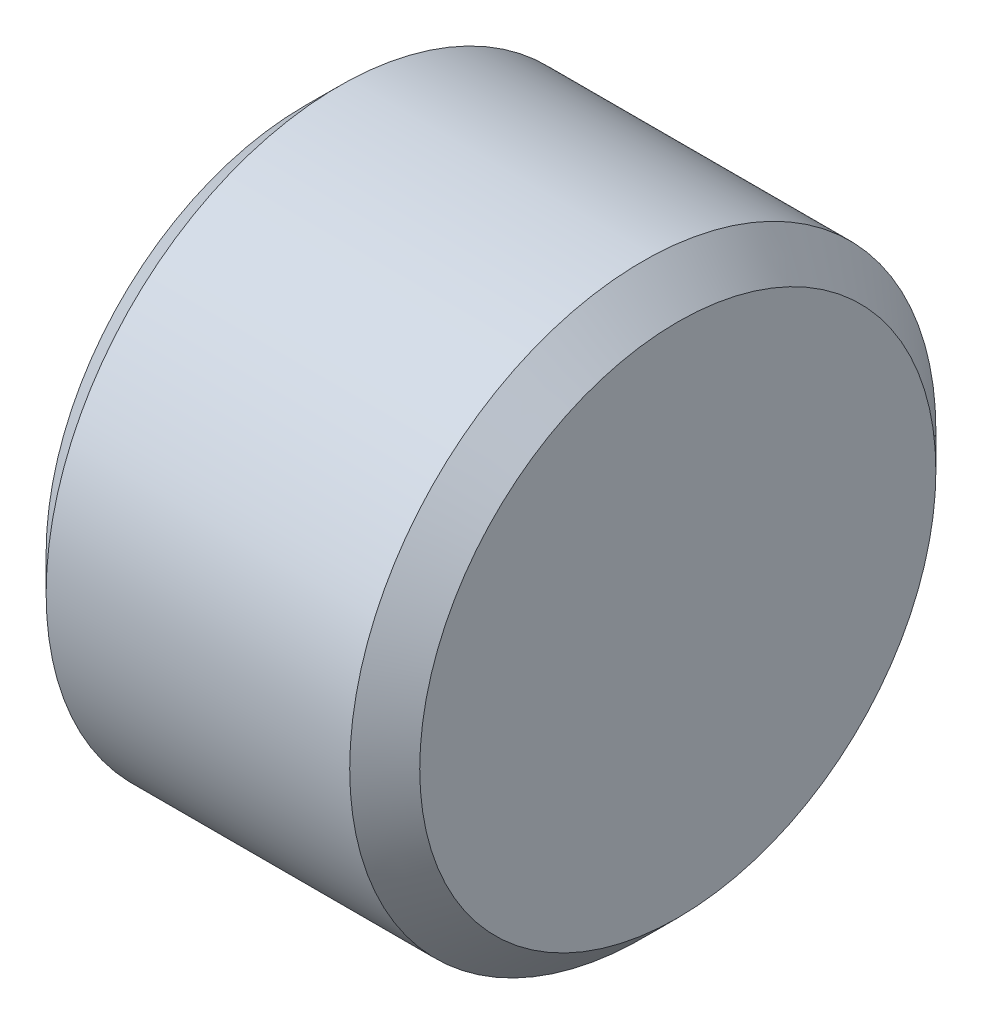
ISO-10303-21;
HEADER;
FILE_DESCRIPTION(('STEP AP214'),'2;1');
FILE_NAME('part.step','',(''),(''),'','','');
FILE_SCHEMA(('AUTOMOTIVE_DESIGN { 1 0 10303 214 1 1 1 1 }'));
ENDSEC;
DATA;
#1=APPLICATION_CONTEXT('core data for automotive mechanical design processes');
#2=APPLICATION_PROTOCOL_DEFINITION('international standard','automotive_design',2000,#1);
#3=PRODUCT_CONTEXT('',#1,'mechanical');
#4=PRODUCT('Part','Part','',(#3));
#5=PRODUCT_RELATED_PRODUCT_CATEGORY('part','',(#4));
#6=PRODUCT_DEFINITION_FORMATION('','',#4);
#7=PRODUCT_DEFINITION_CONTEXT('part definition',#1,'design');
#8=PRODUCT_DEFINITION('design','',#6,#7);
#9=PRODUCT_DEFINITION_SHAPE('','',#8);
#10=(LENGTH_UNIT() NAMED_UNIT(*) SI_UNIT(.MILLI.,.METRE.));
#11=(NAMED_UNIT(*) PLANE_ANGLE_UNIT() SI_UNIT($,.RADIAN.));
#12=(NAMED_UNIT(*) SI_UNIT($,.STERADIAN.) SOLID_ANGLE_UNIT());
#13=UNCERTAINTY_MEASURE_WITH_UNIT(LENGTH_MEASURE(1.E-05),#10,'distance_accuracy_value','');
#14=(GEOMETRIC_REPRESENTATION_CONTEXT(3) GLOBAL_UNCERTAINTY_ASSIGNED_CONTEXT((#13)) GLOBAL_UNIT_ASSIGNED_CONTEXT((#10,
#11,#12)) REPRESENTATION_CONTEXT('',''));
#15=CARTESIAN_POINT('',(0.,0.,0.));
#16=DIRECTION('',(0.,0.,1.));
#17=DIRECTION('',(1.,0.,0.));
#18=AXIS2_PLACEMENT_3D('',#15,#16,#17);
#19=CARTESIAN_POINT('',(0.,-4.283,4.283));
#20=DIRECTION('',(-1.,0.,0.));
#21=DIRECTION('',(0.,1.,0.));
#22=AXIS2_PLACEMENT_3D('',#19,#20,#21);
#23=PLANE('',#22);
#24=CARTESIAN_POINT('',(0.,0.,0.));
#25=DIRECTION('',(-1.,0.,0.));
#26=DIRECTION('',(0.,0.,-1.));
#27=AXIS2_PLACEMENT_3D('',#24,#25,#26);
#28=CIRCLE('',#27,4.283);
#29=CARTESIAN_POINT('',(0.,0.,-4.283));
#30=VERTEX_POINT('',#29);
#31=EDGE_CURVE('E93',#30,#30,#28,.F.);
#32=ORIENTED_EDGE('',*,*,#31,.F.);
#33=EDGE_LOOP('',(#32));
#34=FACE_BOUND('',#33,.T.);
#35=DIRECTION('',(0.,-1.,0.));
#36=VECTOR('',#35,1.);
#37=CARTESIAN_POINT('',(0.,1.2990381056767,2.25));
#38=LINE('',#37,#36);
#39=CARTESIAN_POINT('',(0.,1.2990381056767,2.25));
#40=VERTEX_POINT('',#39);
#41=CARTESIAN_POINT('',(0.,-1.2990381056767,2.25));
#42=VERTEX_POINT('',#41);
#43=EDGE_CURVE('E80',#40,#42,#38,.T.);
#44=ORIENTED_EDGE('',*,*,#43,.T.);
#45=DIRECTION('',(0.,-0.499999999999983,-0.866025403784448));
#46=VECTOR('',#45,1.);
#47=CARTESIAN_POINT('',(0.,-1.2990381056767,2.25));
#48=LINE('',#47,#46);
#49=CARTESIAN_POINT('',(0.,-2.5980762113533,0.));
#50=VERTEX_POINT('',#49);
#51=EDGE_CURVE('E69',#42,#50,#48,.T.);
#52=ORIENTED_EDGE('',*,*,#51,.T.);
#53=DIRECTION('',(0.,0.499999999999984,-0.866025403784448));
#54=VECTOR('',#53,1.);
#55=CARTESIAN_POINT('',(0.,-2.5980762113533,0.));
#56=LINE('',#55,#54);
#57=CARTESIAN_POINT('',(0.,-1.2990381056767,-2.25));
#58=VERTEX_POINT('',#57);
#59=EDGE_CURVE('E79',#50,#58,#56,.T.);
#60=ORIENTED_EDGE('',*,*,#59,.T.);
#61=DIRECTION('',(0.,1.,0.));
#62=VECTOR('',#61,1.);
#63=CARTESIAN_POINT('',(0.,-1.2990381056767,-2.25));
#64=LINE('',#63,#62);
#65=CARTESIAN_POINT('',(0.,1.2990381056767,-2.25));
#66=VERTEX_POINT('',#65);
#67=EDGE_CURVE('E103',#58,#66,#64,.T.);
#68=ORIENTED_EDGE('',*,*,#67,.T.);
#69=DIRECTION('',(0.,0.499999999999983,0.866025403784448));
#70=VECTOR('',#69,1.);
#71=CARTESIAN_POINT('',(0.,1.2990381056767,-2.25));
#72=LINE('',#71,#70);
#73=CARTESIAN_POINT('',(0.,2.5980762113533,0.));
#74=VERTEX_POINT('',#73);
#75=EDGE_CURVE('E108',#66,#74,#72,.T.);
#76=ORIENTED_EDGE('',*,*,#75,.T.);
#77=DIRECTION('',(0.,-0.499999999999983,0.866025403784448));
#78=VECTOR('',#77,1.);
#79=CARTESIAN_POINT('',(0.,2.5980762113533,0.));
#80=LINE('',#79,#78);
#81=EDGE_CURVE('E92',#74,#40,#80,.T.);
#82=ORIENTED_EDGE('',*,*,#81,.T.);
#83=EDGE_LOOP('',(#44,#52,#60,#68,#76,#82));
#84=FACE_BOUND('',#83,.T.);
#85=ADVANCED_FACE('F17',(#34,#84),#23,.T.);
#86=CARTESIAN_POINT('',(6.2,-4.28299979266307,-4.28300000000001));
#87=DIRECTION('',(1.,0.,0.));
#88=DIRECTION('',(0.,1.,0.));
#89=AXIS2_PLACEMENT_3D('',#86,#87,#88);
#90=PLANE('',#89);
#91=CARTESIAN_POINT('',(6.2,0.,0.));
#92=DIRECTION('',(1.,0.,0.));
#93=DIRECTION('',(0.,-1.41924977490617E-07,0.99999999999999));
#94=AXIS2_PLACEMENT_3D('',#91,#92,#93);
#95=CIRCLE('',#94,4.283);
#96=CARTESIAN_POINT('',(6.2,-6.07864678592311E-07,4.28299999999996));
#97=VERTEX_POINT('',#96);
#98=EDGE_CURVE('E115',#97,#97,#95,.T.);
#99=ORIENTED_EDGE('',*,*,#98,.T.);
#100=EDGE_LOOP('',(#99));
#101=FACE_BOUND('',#100,.T.);
#102=ADVANCED_FACE('F177',(#101),#90,.T.);
#103=CARTESIAN_POINT('',(2.,-1.2990381056767,2.25));
#104=DIRECTION('',(0.,0.,-1.));
#105=DIRECTION('',(-1.,0.,0.));
#106=AXIS2_PLACEMENT_3D('',#103,#104,#105);
#107=PLANE('',#106);
#108=ORIENTED_EDGE('',*,*,#43,.F.);
#109=DIRECTION('',(1.,0.,0.));
#110=VECTOR('',#109,1.);
#111=CARTESIAN_POINT('',(0.,1.2990381056767,2.25));
#112=LINE('',#111,#110);
#113=CARTESIAN_POINT('',(2.,1.2990381056767,2.25));
#114=VERTEX_POINT('',#113);
#115=EDGE_CURVE('E120',#114,#40,#112,.F.);
#116=ORIENTED_EDGE('',*,*,#115,.F.);
#117=DIRECTION('',(0.,-1.,0.));
#118=VECTOR('',#117,1.);
#119=CARTESIAN_POINT('',(2.,1.2990381056767,2.25));
#120=LINE('',#119,#118);
#121=CARTESIAN_POINT('',(2.,-1.2990381056767,2.25));
#122=VERTEX_POINT('',#121);
#123=EDGE_CURVE('E87',#114,#122,#120,.T.);
#124=ORIENTED_EDGE('',*,*,#123,.T.);
#125=DIRECTION('',(-1.,0.,0.));
#126=VECTOR('',#125,1.);
#127=CARTESIAN_POINT('',(2.,-1.2990381056767,2.25));
#128=LINE('',#127,#126);
#129=EDGE_CURVE('E73',#122,#42,#128,.T.);
#130=ORIENTED_EDGE('',*,*,#129,.T.);
#131=EDGE_LOOP('',(#108,#116,#124,#130));
#132=FACE_BOUND('',#131,.T.);
#133=ADVANCED_FACE('F85',(#132),#107,.T.);
#134=CARTESIAN_POINT('',(0.,-2.5980762113533,0.));
#135=DIRECTION('',(0.,0.866025403784448,-0.499999999999983));
#136=DIRECTION('',(0.,0.499999999999983,0.866025403784448));
#137=AXIS2_PLACEMENT_3D('',#134,#135,#136);
#138=PLANE('',#137);
#139=ORIENTED_EDGE('',*,*,#51,.F.);
#140=ORIENTED_EDGE('',*,*,#129,.F.);
#141=DIRECTION('',(0.,-0.499999999999983,-0.866025403784448));
#142=VECTOR('',#141,1.);
#143=CARTESIAN_POINT('',(2.,-1.2990381056767,2.25));
#144=LINE('',#143,#142);
#145=CARTESIAN_POINT('',(2.,-2.5980762113533,0.));
#146=VERTEX_POINT('',#145);
#147=EDGE_CURVE('E88',#122,#146,#144,.T.);
#148=ORIENTED_EDGE('',*,*,#147,.T.);
#149=DIRECTION('',(-1.,0.,0.));
#150=VECTOR('',#149,1.);
#151=CARTESIAN_POINT('',(2.,-2.5980762113533,0.));
#152=LINE('',#151,#150);
#153=EDGE_CURVE('E75',#146,#50,#152,.T.);
#154=ORIENTED_EDGE('',*,*,#153,.T.);
#155=EDGE_LOOP('',(#139,#140,#148,#154));
#156=FACE_BOUND('',#155,.T.);
#157=ADVANCED_FACE('F71',(#156),#138,.T.);
#158=CARTESIAN_POINT('',(0.,-1.2990381056767,-2.25));
#159=DIRECTION('',(0.,0.866025403784448,0.499999999999983));
#160=DIRECTION('',(0.,-0.499999999999983,0.866025403784448));
#161=AXIS2_PLACEMENT_3D('',#158,#159,#160);
#162=PLANE('',#161);
#163=ORIENTED_EDGE('',*,*,#59,.F.);
#164=ORIENTED_EDGE('',*,*,#153,.F.);
#165=DIRECTION('',(0.,0.499999999999983,-0.866025403784448));
#166=VECTOR('',#165,1.);
#167=CARTESIAN_POINT('',(2.,-2.5980762113533,0.));
#168=LINE('',#167,#166);
#169=CARTESIAN_POINT('',(2.,-1.2990381056767,-2.25));
#170=VERTEX_POINT('',#169);
#171=EDGE_CURVE('E133',#146,#170,#168,.T.);
#172=ORIENTED_EDGE('',*,*,#171,.T.);
#173=DIRECTION('',(-1.,0.,0.));
#174=VECTOR('',#173,1.);
#175=CARTESIAN_POINT('',(2.,-1.2990381056767,-2.25));
#176=LINE('',#175,#174);
#177=EDGE_CURVE('E138',#170,#58,#176,.T.);
#178=ORIENTED_EDGE('',*,*,#177,.T.);
#179=EDGE_LOOP('',(#163,#164,#172,#178));
#180=FACE_BOUND('',#179,.T.);
#181=ADVANCED_FACE('F190',(#180),#162,.T.);
#182=CARTESIAN_POINT('',(0.,-1.2990381056767,-2.25));
#183=DIRECTION('',(0.,0.,1.));
#184=DIRECTION('',(1.,0.,0.));
#185=AXIS2_PLACEMENT_3D('',#182,#183,#184);
#186=PLANE('',#185);
#187=ORIENTED_EDGE('',*,*,#67,.F.);
#188=ORIENTED_EDGE('',*,*,#177,.F.);
#189=DIRECTION('',(0.,1.,0.));
#190=VECTOR('',#189,1.);
#191=CARTESIAN_POINT('',(2.,-1.2990381056767,-2.25));
#192=LINE('',#191,#190);
#193=CARTESIAN_POINT('',(2.,1.2990381056767,-2.25));
#194=VERTEX_POINT('',#193);
#195=EDGE_CURVE('E143',#170,#194,#192,.T.);
#196=ORIENTED_EDGE('',*,*,#195,.T.);
#197=DIRECTION('',(-1.,0.,0.));
#198=VECTOR('',#197,1.);
#199=CARTESIAN_POINT('',(2.,1.2990381056767,-2.25));
#200=LINE('',#199,#198);
#201=EDGE_CURVE('E147',#194,#66,#200,.T.);
#202=ORIENTED_EDGE('',*,*,#201,.T.);
#203=EDGE_LOOP('',(#187,#188,#196,#202));
#204=FACE_BOUND('',#203,.T.);
#205=ADVANCED_FACE('F193',(#204),#186,.T.);
#206=CARTESIAN_POINT('',(0.,2.5980762113533,0.));
#207=DIRECTION('',(0.,-0.866025403784448,0.499999999999983));
#208=DIRECTION('',(0.,-0.499999999999983,-0.866025403784448));
#209=AXIS2_PLACEMENT_3D('',#206,#207,#208);
#210=PLANE('',#209);
#211=ORIENTED_EDGE('',*,*,#75,.F.);
#212=ORIENTED_EDGE('',*,*,#201,.F.);
#213=DIRECTION('',(0.,0.499999999999983,0.866025403784448));
#214=VECTOR('',#213,1.);
#215=CARTESIAN_POINT('',(2.,1.2990381056767,-2.25));
#216=LINE('',#215,#214);
#217=CARTESIAN_POINT('',(2.,2.5980762113533,0.));
#218=VERTEX_POINT('',#217);
#219=EDGE_CURVE('E36',#194,#218,#216,.T.);
#220=ORIENTED_EDGE('',*,*,#219,.T.);
#221=DIRECTION('',(-1.,0.,0.));
#222=VECTOR('',#221,1.);
#223=CARTESIAN_POINT('',(2.,2.5980762113533,0.));
#224=LINE('',#223,#222);
#225=EDGE_CURVE('E155',#218,#74,#224,.T.);
#226=ORIENTED_EDGE('',*,*,#225,.T.);
#227=EDGE_LOOP('',(#211,#212,#220,#226));
#228=FACE_BOUND('',#227,.T.);
#229=ADVANCED_FACE('F197',(#228),#210,.T.);
#230=CARTESIAN_POINT('',(0.,1.2990381056767,2.25));
#231=DIRECTION('',(0.,-0.866025403784448,-0.499999999999983));
#232=DIRECTION('',(0.,0.499999999999983,-0.866025403784448));
#233=AXIS2_PLACEMENT_3D('',#230,#231,#232);
#234=PLANE('',#233);
#235=ORIENTED_EDGE('',*,*,#81,.F.);
#236=ORIENTED_EDGE('',*,*,#225,.F.);
#237=DIRECTION('',(0.,-0.499999999999983,0.866025403784448));
#238=VECTOR('',#237,1.);
#239=CARTESIAN_POINT('',(2.,2.5980762113533,0.));
#240=LINE('',#239,#238);
#241=EDGE_CURVE('E32',#218,#114,#240,.T.);
#242=ORIENTED_EDGE('',*,*,#241,.T.);
#243=ORIENTED_EDGE('',*,*,#115,.T.);
#244=EDGE_LOOP('',(#235,#236,#242,#243));
#245=FACE_BOUND('',#244,.T.);
#246=ADVANCED_FACE('F201',(#245),#234,.T.);
#247=CARTESIAN_POINT('',(2.,-2.5980762113533,2.25));
#248=DIRECTION('',(-1.,0.,0.));
#249=DIRECTION('',(0.,1.,0.));
#250=AXIS2_PLACEMENT_3D('',#247,#248,#249);
#251=PLANE('',#250);
#252=ORIENTED_EDGE('',*,*,#123,.F.);
#253=ORIENTED_EDGE('',*,*,#241,.F.);
#254=ORIENTED_EDGE('',*,*,#219,.F.);
#255=ORIENTED_EDGE('',*,*,#195,.F.);
#256=ORIENTED_EDGE('',*,*,#171,.F.);
#257=ORIENTED_EDGE('',*,*,#147,.F.);
#258=EDGE_LOOP('',(#252,#253,#254,#255,#256,#257));
#259=FACE_BOUND('',#258,.T.);
#260=ADVANCED_FACE('F172',(#259),#251,.T.);
#261=CARTESIAN_POINT('',(0.58100000000001,0.,0.));
#262=DIRECTION('',(1.,0.,0.));
#263=DIRECTION('',(0.,1.92342708767309E-10,1.));
#264=AXIS2_PLACEMENT_3D('',#261,#262,#263);
#265=CONICAL_SURFACE('',#264,4.864,0.785398163397439);
#266=CARTESIAN_POINT('',(0.58100000000001,0.,0.));
#267=DIRECTION('',(-1.,0.,0.));
#268=DIRECTION('',(0.,0.,-1.));
#269=AXIS2_PLACEMENT_3D('',#266,#267,#268);
#270=CIRCLE('',#269,4.864);
#271=CARTESIAN_POINT('',(0.58100000000001,0.,-4.864));
#272=VERTEX_POINT('',#271);
#273=EDGE_CURVE('E25',#272,#272,#270,.F.);
#274=ORIENTED_EDGE('',*,*,#273,.F.);
#275=EDGE_LOOP('',(#274));
#276=FACE_BOUND('',#275,.T.);
#277=ORIENTED_EDGE('',*,*,#31,.T.);
#278=EDGE_LOOP('',(#277));
#279=FACE_BOUND('',#278,.T.);
#280=ADVANCED_FACE('F169',(#276,#279),#265,.T.);
#281=CARTESIAN_POINT('',(6.2,0.,0.));
#282=DIRECTION('',(1.,0.,0.));
#283=DIRECTION('',(0.,7.69369579496778E-10,1.));
#284=AXIS2_PLACEMENT_3D('',#281,#282,#283);
#285=CYLINDRICAL_SURFACE('',#284,4.864);
#286=CARTESIAN_POINT('',(5.619,0.,0.));
#287=DIRECTION('',(-1.,0.,0.));
#288=DIRECTION('',(0.,0.,-1.));
#289=AXIS2_PLACEMENT_3D('',#286,#287,#288);
#290=CIRCLE('',#289,4.864);
#291=CARTESIAN_POINT('',(5.619,0.,-4.864));
#292=VERTEX_POINT('',#291);
#293=EDGE_CURVE('E11',#292,#292,#290,.F.);
#294=ORIENTED_EDGE('',*,*,#293,.F.);
#295=EDGE_LOOP('',(#294));
#296=FACE_BOUND('',#295,.T.);
#297=ORIENTED_EDGE('',*,*,#273,.T.);
#298=EDGE_LOOP('',(#297));
#299=FACE_BOUND('',#298,.T.);
#300=ADVANCED_FACE('F167',(#296,#299),#285,.T.);
#301=CARTESIAN_POINT('',(5.619,0.,0.));
#302=DIRECTION('',(-1.,0.,0.));
#303=DIRECTION('',(0.,0.,-1.));
#304=AXIS2_PLACEMENT_3D('',#301,#302,#303);
#305=CONICAL_SURFACE('',#304,4.864,0.785398163397447);
#306=ORIENTED_EDGE('',*,*,#98,.F.);
#307=EDGE_LOOP('',(#306));
#308=FACE_BOUND('',#307,.T.);
#309=ORIENTED_EDGE('',*,*,#293,.T.);
#310=EDGE_LOOP('',(#309));
#311=FACE_BOUND('',#310,.T.);
#312=ADVANCED_FACE('F19',(#308,#311),#305,.T.);
#313=CLOSED_SHELL('',(#85,#102,#133,#157,#181,#205,#229,#246,#260,#280,#300,#312));
#314=MANIFOLD_SOLID_BREP('B1',#313);
#315=ADVANCED_BREP_SHAPE_REPRESENTATION('',(#18,#314),#14);
#316=SHAPE_DEFINITION_REPRESENTATION(#9,#315);
ENDSEC;
END-ISO-10303-21;
